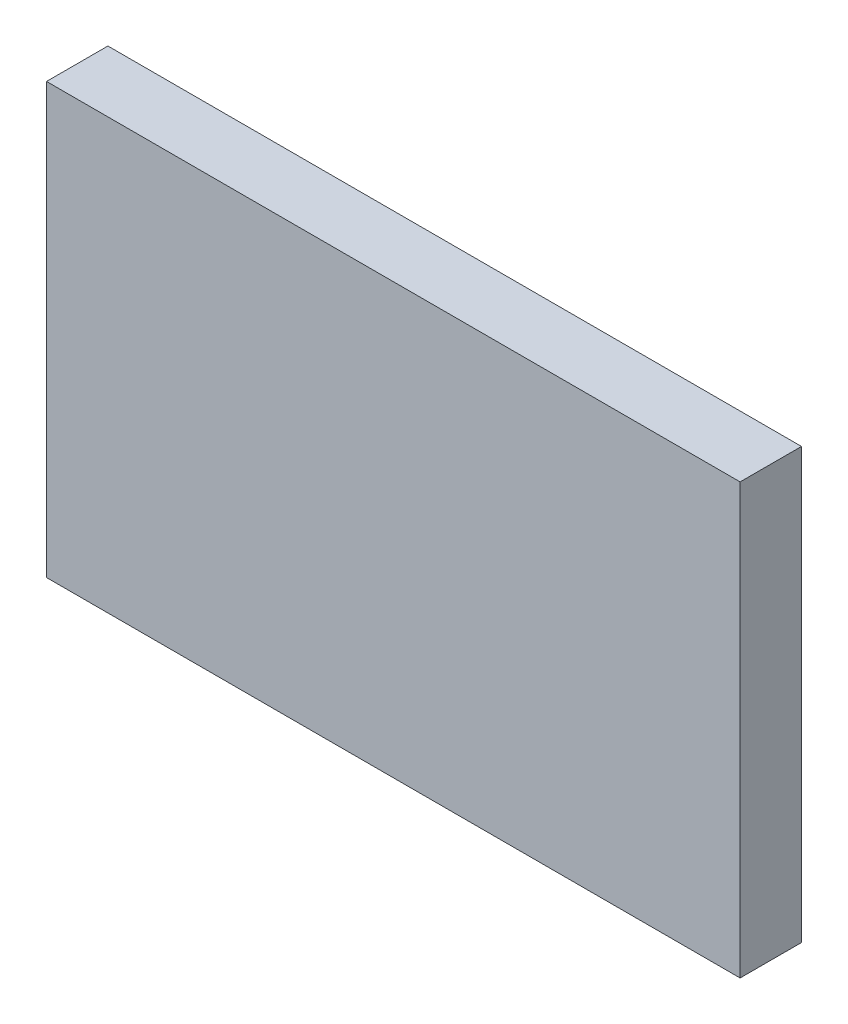
ISO-10303-21;
HEADER;
FILE_DESCRIPTION(('STEP AP214'),'2;1');
FILE_NAME('part.step','',(''),(''),'','','');
FILE_SCHEMA(('AUTOMOTIVE_DESIGN { 1 0 10303 214 1 1 1 1 }'));
ENDSEC;
DATA;
#1=APPLICATION_CONTEXT('core data for automotive mechanical design processes');
#2=APPLICATION_PROTOCOL_DEFINITION('international standard','automotive_design',2000,#1);
#3=PRODUCT_CONTEXT('',#1,'mechanical');
#4=PRODUCT('Part','Part','',(#3));
#5=PRODUCT_RELATED_PRODUCT_CATEGORY('part','',(#4));
#6=PRODUCT_DEFINITION_FORMATION('','',#4);
#7=PRODUCT_DEFINITION_CONTEXT('part definition',#1,'design');
#8=PRODUCT_DEFINITION('design','',#6,#7);
#9=PRODUCT_DEFINITION_SHAPE('','',#8);
#10=(LENGTH_UNIT() NAMED_UNIT(*) SI_UNIT(.MILLI.,.METRE.));
#11=(NAMED_UNIT(*) PLANE_ANGLE_UNIT() SI_UNIT($,.RADIAN.));
#12=(NAMED_UNIT(*) SI_UNIT($,.STERADIAN.) SOLID_ANGLE_UNIT());
#13=UNCERTAINTY_MEASURE_WITH_UNIT(LENGTH_MEASURE(1.E-05),#10,'distance_accuracy_value','');
#14=(GEOMETRIC_REPRESENTATION_CONTEXT(3) GLOBAL_UNCERTAINTY_ASSIGNED_CONTEXT((#13)) GLOBAL_UNIT_ASSIGNED_CONTEXT((#10,
#11,#12)) REPRESENTATION_CONTEXT('',''));
#15=CARTESIAN_POINT('',(0.,0.,0.));
#16=DIRECTION('',(0.,0.,1.));
#17=DIRECTION('',(1.,0.,0.));
#18=AXIS2_PLACEMENT_3D('',#15,#16,#17);
#19=CARTESIAN_POINT('',(-35.8775,44.45,3.175));
#20=DIRECTION('',(1.,0.,0.));
#21=DIRECTION('',(0.,0.,-1.));
#22=AXIS2_PLACEMENT_3D('',#19,#20,#21);
#23=PLANE('',#22);
#24=DIRECTION('',(0.,-1.,0.));
#25=VECTOR('',#24,1.);
#26=CARTESIAN_POINT('',(-35.8775,44.45,-3.175));
#27=LINE('',#26,#25);
#28=CARTESIAN_POINT('',(-35.8775,44.45,-3.175));
#29=VERTEX_POINT('',#28);
#30=CARTESIAN_POINT('',(-35.8775,0.,-3.175));
#31=VERTEX_POINT('',#30);
#32=EDGE_CURVE('E98',#29,#31,#27,.T.);
#33=ORIENTED_EDGE('',*,*,#32,.T.);
#34=DIRECTION('',(0.,0.,-1.));
#35=VECTOR('',#34,1.);
#36=CARTESIAN_POINT('',(-35.8775,0.,3.175));
#37=LINE('',#36,#35);
#38=CARTESIAN_POINT('',(-35.8775,0.,3.175));
#39=VERTEX_POINT('',#38);
#40=EDGE_CURVE('E11',#39,#31,#37,.T.);
#41=ORIENTED_EDGE('',*,*,#40,.F.);
#42=DIRECTION('',(0.,-1.,0.));
#43=VECTOR('',#42,1.);
#44=CARTESIAN_POINT('',(-35.8775,44.45,3.175));
#45=LINE('',#44,#43);
#46=CARTESIAN_POINT('',(-35.8775,44.45,3.175));
#47=VERTEX_POINT('',#46);
#48=EDGE_CURVE('E86',#47,#39,#45,.T.);
#49=ORIENTED_EDGE('',*,*,#48,.F.);
#50=DIRECTION('',(0.,0.,-1.));
#51=VECTOR('',#50,1.);
#52=CARTESIAN_POINT('',(-35.8775,44.45,3.175));
#53=LINE('',#52,#51);
#54=EDGE_CURVE('E94',#47,#29,#53,.T.);
#55=ORIENTED_EDGE('',*,*,#54,.T.);
#56=EDGE_LOOP('',(#33,#41,#49,#55));
#57=FACE_BOUND('',#56,.T.);
#58=ADVANCED_FACE('F35',(#57),#23,.F.);
#59=CARTESIAN_POINT('',(-35.8775,0.,3.175));
#60=DIRECTION('',(0.,1.,0.));
#61=DIRECTION('',(-1.,0.,0.));
#62=AXIS2_PLACEMENT_3D('',#59,#60,#61);
#63=PLANE('',#62);
#64=DIRECTION('',(1.,0.,0.));
#65=VECTOR('',#64,1.);
#66=CARTESIAN_POINT('',(-35.8775,0.,-3.175));
#67=LINE('',#66,#65);
#68=CARTESIAN_POINT('',(35.8775,0.,-3.175));
#69=VERTEX_POINT('',#68);
#70=EDGE_CURVE('E90',#31,#69,#67,.T.);
#71=ORIENTED_EDGE('',*,*,#70,.T.);
#72=DIRECTION('',(0.,0.,-1.));
#73=VECTOR('',#72,1.);
#74=CARTESIAN_POINT('',(35.8775,0.,3.175));
#75=LINE('',#74,#73);
#76=CARTESIAN_POINT('',(35.8775,0.,3.175));
#77=VERTEX_POINT('',#76);
#78=EDGE_CURVE('E43',#77,#69,#75,.T.);
#79=ORIENTED_EDGE('',*,*,#78,.F.);
#80=DIRECTION('',(1.,0.,0.));
#81=VECTOR('',#80,1.);
#82=CARTESIAN_POINT('',(-35.8775,0.,3.175));
#83=LINE('',#82,#81);
#84=EDGE_CURVE('E81',#39,#77,#83,.T.);
#85=ORIENTED_EDGE('',*,*,#84,.F.);
#86=ORIENTED_EDGE('',*,*,#40,.T.);
#87=EDGE_LOOP('',(#71,#79,#85,#86));
#88=FACE_BOUND('',#87,.T.);
#89=ADVANCED_FACE('F89',(#88),#63,.F.);
#90=CARTESIAN_POINT('',(35.8775,0.,3.175));
#91=DIRECTION('',(-1.,0.,0.));
#92=DIRECTION('',(0.,-1.,0.));
#93=AXIS2_PLACEMENT_3D('',#90,#91,#92);
#94=PLANE('',#93);
#95=DIRECTION('',(0.,1.,0.));
#96=VECTOR('',#95,1.);
#97=CARTESIAN_POINT('',(35.8775,0.,-3.175));
#98=LINE('',#97,#96);
#99=CARTESIAN_POINT('',(35.8775,44.45,-3.175));
#100=VERTEX_POINT('',#99);
#101=EDGE_CURVE('E68',#69,#100,#98,.T.);
#102=ORIENTED_EDGE('',*,*,#101,.T.);
#103=DIRECTION('',(0.,0.,-1.));
#104=VECTOR('',#103,1.);
#105=CARTESIAN_POINT('',(35.8775,44.45,3.175));
#106=LINE('',#105,#104);
#107=CARTESIAN_POINT('',(35.8775,44.45,3.175));
#108=VERTEX_POINT('',#107);
#109=EDGE_CURVE('E91',#108,#100,#106,.T.);
#110=ORIENTED_EDGE('',*,*,#109,.F.);
#111=DIRECTION('',(0.,1.,0.));
#112=VECTOR('',#111,1.);
#113=CARTESIAN_POINT('',(35.8775,0.,3.175));
#114=LINE('',#113,#112);
#115=EDGE_CURVE('E84',#77,#108,#114,.T.);
#116=ORIENTED_EDGE('',*,*,#115,.F.);
#117=ORIENTED_EDGE('',*,*,#78,.T.);
#118=EDGE_LOOP('',(#102,#110,#116,#117));
#119=FACE_BOUND('',#118,.T.);
#120=ADVANCED_FACE('F92',(#119),#94,.F.);
#121=CARTESIAN_POINT('',(35.8775,44.45,3.175));
#122=DIRECTION('',(0.,-1.,0.));
#123=DIRECTION('',(1.,0.,0.));
#124=AXIS2_PLACEMENT_3D('',#121,#122,#123);
#125=PLANE('',#124);
#126=DIRECTION('',(-1.,0.,0.));
#127=VECTOR('',#126,1.);
#128=CARTESIAN_POINT('',(35.8775,44.45,-3.175));
#129=LINE('',#128,#127);
#130=EDGE_CURVE('E74',#100,#29,#129,.T.);
#131=ORIENTED_EDGE('',*,*,#130,.T.);
#132=ORIENTED_EDGE('',*,*,#54,.F.);
#133=DIRECTION('',(-1.,0.,0.));
#134=VECTOR('',#133,1.);
#135=CARTESIAN_POINT('',(35.8775,44.45,3.175));
#136=LINE('',#135,#134);
#137=EDGE_CURVE('E51',#108,#47,#136,.T.);
#138=ORIENTED_EDGE('',*,*,#137,.F.);
#139=ORIENTED_EDGE('',*,*,#109,.T.);
#140=EDGE_LOOP('',(#131,#132,#138,#139));
#141=FACE_BOUND('',#140,.T.);
#142=ADVANCED_FACE('F105',(#141),#125,.F.);
#143=CARTESIAN_POINT('',(0.,0.,3.175));
#144=DIRECTION('',(0.,0.,1.));
#145=DIRECTION('',(1.,0.,0.));
#146=AXIS2_PLACEMENT_3D('',#143,#144,#145);
#147=PLANE('',#146);
#148=ORIENTED_EDGE('',*,*,#48,.T.);
#149=ORIENTED_EDGE('',*,*,#84,.T.);
#150=ORIENTED_EDGE('',*,*,#115,.T.);
#151=ORIENTED_EDGE('',*,*,#137,.T.);
#152=EDGE_LOOP('',(#148,#149,#150,#151));
#153=FACE_BOUND('',#152,.T.);
#154=ADVANCED_FACE('F82',(#153),#147,.T.);
#155=CARTESIAN_POINT('',(0.,0.,-3.175));
#156=DIRECTION('',(0.,0.,1.));
#157=DIRECTION('',(1.,0.,0.));
#158=AXIS2_PLACEMENT_3D('',#155,#156,#157);
#159=PLANE('',#158);
#160=ORIENTED_EDGE('',*,*,#32,.F.);
#161=ORIENTED_EDGE('',*,*,#130,.F.);
#162=ORIENTED_EDGE('',*,*,#101,.F.);
#163=ORIENTED_EDGE('',*,*,#70,.F.);
#164=EDGE_LOOP('',(#160,#161,#162,#163));
#165=FACE_BOUND('',#164,.T.);
#166=ADVANCED_FACE('F108',(#165),#159,.F.);
#167=CLOSED_SHELL('',(#58,#89,#120,#142,#154,#166));
#168=MANIFOLD_SOLID_BREP('B2',#167);
#169=ADVANCED_BREP_SHAPE_REPRESENTATION('',(#18,#168),#14);
#170=SHAPE_DEFINITION_REPRESENTATION(#9,#169);
ENDSEC;
END-ISO-10303-21;
